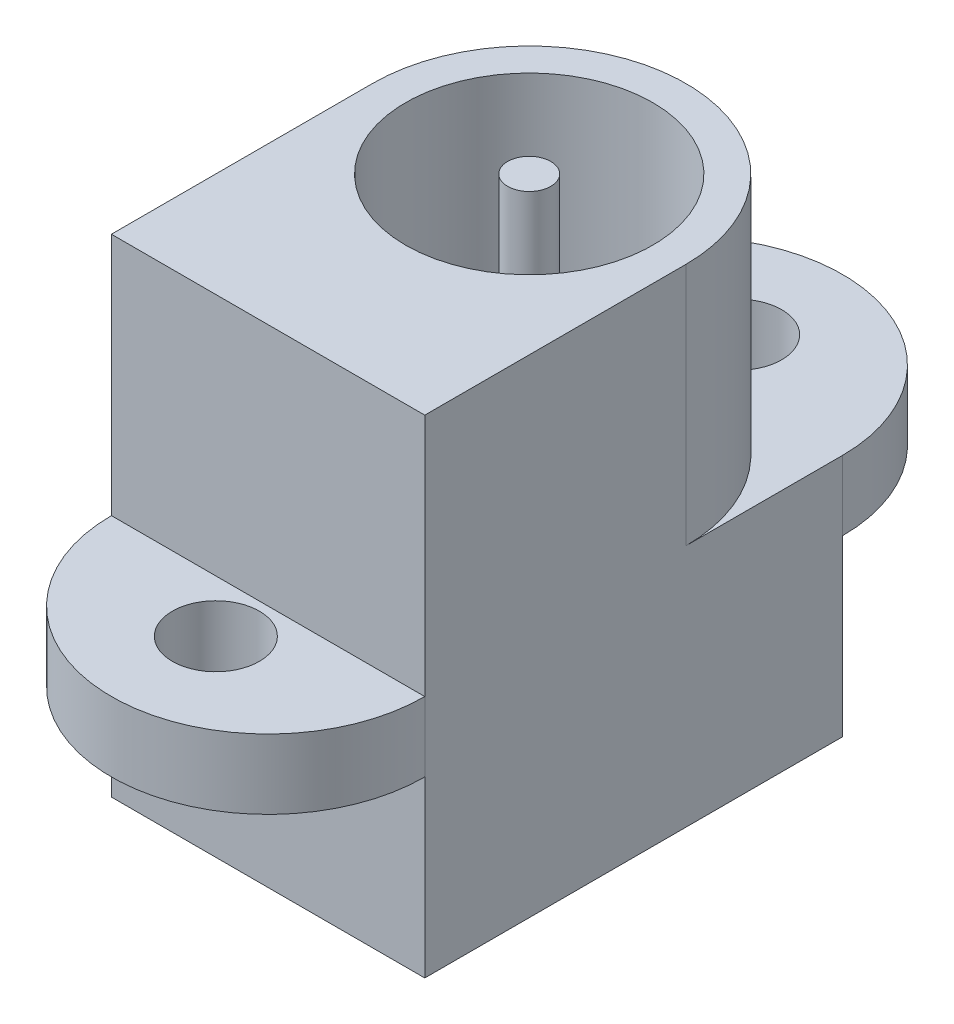
ISO-10303-21;
HEADER;
FILE_DESCRIPTION(('STEP AP214'),'2;1');
FILE_NAME('part.step','',(''),(''),'','','');
FILE_SCHEMA(('AUTOMOTIVE_DESIGN { 1 0 10303 214 1 1 1 1 }'));
ENDSEC;
DATA;
#1=APPLICATION_CONTEXT('core data for automotive mechanical design processes');
#2=APPLICATION_PROTOCOL_DEFINITION('international standard','automotive_design',2000,#1);
#3=PRODUCT_CONTEXT('',#1,'mechanical');
#4=PRODUCT('Part','Part','',(#3));
#5=PRODUCT_RELATED_PRODUCT_CATEGORY('part','',(#4));
#6=PRODUCT_DEFINITION_FORMATION('','',#4);
#7=PRODUCT_DEFINITION_CONTEXT('part definition',#1,'design');
#8=PRODUCT_DEFINITION('design','',#6,#7);
#9=PRODUCT_DEFINITION_SHAPE('','',#8);
#10=(LENGTH_UNIT() NAMED_UNIT(*) SI_UNIT(.MILLI.,.METRE.));
#11=(NAMED_UNIT(*) PLANE_ANGLE_UNIT() SI_UNIT($,.RADIAN.));
#12=(NAMED_UNIT(*) SI_UNIT($,.STERADIAN.) SOLID_ANGLE_UNIT());
#13=UNCERTAINTY_MEASURE_WITH_UNIT(LENGTH_MEASURE(1.E-05),#10,'distance_accuracy_value','');
#14=(GEOMETRIC_REPRESENTATION_CONTEXT(3) GLOBAL_UNCERTAINTY_ASSIGNED_CONTEXT((#13)) GLOBAL_UNIT_ASSIGNED_CONTEXT((#10,
#11,#12)) REPRESENTATION_CONTEXT('',''));
#15=CARTESIAN_POINT('',(0.,0.,0.));
#16=DIRECTION('',(0.,0.,1.));
#17=DIRECTION('',(1.,0.,0.));
#18=AXIS2_PLACEMENT_3D('',#15,#16,#17);
#19=CARTESIAN_POINT('',(0.,-2.,-6.));
#20=DIRECTION('',(0.,1.,0.));
#21=DIRECTION('',(0.,0.,1.));
#22=AXIS2_PLACEMENT_3D('',#19,#20,#21);
#23=PLANE('',#22);
#24=CARTESIAN_POINT('',(0.,-2.,-7.5));
#25=DIRECTION('',(0.,1.,0.));
#26=DIRECTION('',(0.,0.,1.));
#27=AXIS2_PLACEMENT_3D('',#24,#25,#26);
#28=CIRCLE('',#27,1.25);
#29=CARTESIAN_POINT('',(0.,-2.,-6.25));
#30=VERTEX_POINT('',#29);
#31=EDGE_CURVE('E208',#30,#30,#28,.T.);
#32=ORIENTED_EDGE('',*,*,#31,.T.);
#33=EDGE_LOOP('',(#32));
#34=FACE_BOUND('',#33,.T.);
#35=DIRECTION('',(1.,0.,0.));
#36=VECTOR('',#35,1.);
#37=CARTESIAN_POINT('',(4.5,-2.,-6.));
#38=LINE('',#37,#36);
#39=CARTESIAN_POINT('',(-4.5,-2.,-6.));
#40=VERTEX_POINT('',#39);
#41=CARTESIAN_POINT('',(4.5,-2.,-6.));
#42=VERTEX_POINT('',#41);
#43=EDGE_CURVE('E94',#40,#42,#38,.T.);
#44=ORIENTED_EDGE('',*,*,#43,.F.);
#45=CARTESIAN_POINT('',(0.,-2.,-6.));
#46=DIRECTION('',(0.,1.,0.));
#47=DIRECTION('',(0.,0.,1.));
#48=AXIS2_PLACEMENT_3D('',#45,#46,#47);
#49=CIRCLE('',#48,4.5);
#50=EDGE_CURVE('E214',#42,#40,#49,.T.);
#51=ORIENTED_EDGE('',*,*,#50,.F.);
#52=EDGE_LOOP('',(#44,#51));
#53=FACE_BOUND('',#52,.T.);
#54=ADVANCED_FACE('F48',(#34,#53),#23,.F.);
#55=CARTESIAN_POINT('',(0.,-2.,7.5));
#56=DIRECTION('',(0.,1.,0.));
#57=DIRECTION('',(0.,0.,1.));
#58=AXIS2_PLACEMENT_3D('',#55,#56,#57);
#59=CIRCLE('',#58,1.25);
#60=CARTESIAN_POINT('',(0.,-2.,8.75));
#61=VERTEX_POINT('',#60);
#62=EDGE_CURVE('E199',#61,#61,#59,.T.);
#63=ORIENTED_EDGE('',*,*,#62,.T.);
#64=EDGE_LOOP('',(#63));
#65=FACE_BOUND('',#64,.T.);
#66=DIRECTION('',(-1.,0.,0.));
#67=VECTOR('',#66,1.);
#68=CARTESIAN_POINT('',(4.5,-2.,6.));
#69=LINE('',#68,#67);
#70=CARTESIAN_POINT('',(4.5,-2.,6.));
#71=VERTEX_POINT('',#70);
#72=CARTESIAN_POINT('',(-4.5,-2.,6.));
#73=VERTEX_POINT('',#72);
#74=EDGE_CURVE('E253',#71,#73,#69,.T.);
#75=ORIENTED_EDGE('',*,*,#74,.F.);
#76=CARTESIAN_POINT('',(0.,-2.,6.));
#77=DIRECTION('',(0.,1.,0.));
#78=DIRECTION('',(0.,0.,1.));
#79=AXIS2_PLACEMENT_3D('',#76,#77,#78);
#80=CIRCLE('',#79,4.5);
#81=EDGE_CURVE('E216',#73,#71,#80,.T.);
#82=ORIENTED_EDGE('',*,*,#81,.F.);
#83=EDGE_LOOP('',(#75,#82));
#84=FACE_BOUND('',#83,.T.);
#85=ADVANCED_FACE('F266',(#65,#84),#23,.F.);
#86=CARTESIAN_POINT('',(0.,0.,-6.));
#87=DIRECTION('',(0.,1.,0.));
#88=DIRECTION('',(0.,0.,1.));
#89=AXIS2_PLACEMENT_3D('',#86,#87,#88);
#90=PLANE('',#89);
#91=CARTESIAN_POINT('',(0.,0.,-1.5));
#92=DIRECTION('',(0.,1.,0.));
#93=DIRECTION('',(0.,0.,1.));
#94=AXIS2_PLACEMENT_3D('',#91,#92,#93);
#95=CIRCLE('',#94,3.54889262733616);
#96=CARTESIAN_POINT('',(0.,0.,2.04889262733616));
#97=VERTEX_POINT('',#96);
#98=EDGE_CURVE('E162',#97,#97,#95,.T.);
#99=ORIENTED_EDGE('',*,*,#98,.T.);
#100=EDGE_LOOP('',(#99));
#101=FACE_BOUND('',#100,.T.);
#102=CARTESIAN_POINT('',(0.,0.,-1.5));
#103=DIRECTION('',(0.,1.,0.));
#104=DIRECTION('',(0.,0.,1.));
#105=AXIS2_PLACEMENT_3D('',#102,#103,#104);
#106=CIRCLE('',#105,0.619205298013242);
#107=CARTESIAN_POINT('',(0.,0.,-0.880794701986761));
#108=VERTEX_POINT('',#107);
#109=EDGE_CURVE('E152',#108,#108,#106,.T.);
#110=ORIENTED_EDGE('',*,*,#109,.F.);
#111=EDGE_LOOP('',(#110));
#112=FACE_BOUND('',#111,.T.);
#113=ADVANCED_FACE('F272',(#101,#112),#90,.T.);
#114=DIRECTION('',(1.,0.,0.));
#115=VECTOR('',#114,1.);
#116=CARTESIAN_POINT('',(-17.9124652197812,0.,6.));
#117=LINE('',#116,#115);
#118=CARTESIAN_POINT('',(-4.5,0.,6.));
#119=VERTEX_POINT('',#118);
#120=CARTESIAN_POINT('',(4.5,0.,6.));
#121=VERTEX_POINT('',#120);
#122=EDGE_CURVE('E168',#119,#121,#117,.T.);
#123=ORIENTED_EDGE('',*,*,#122,.F.);
#124=CARTESIAN_POINT('',(0.,0.,6.));
#125=DIRECTION('',(0.,1.,0.));
#126=DIRECTION('',(0.,0.,1.));
#127=AXIS2_PLACEMENT_3D('',#124,#125,#126);
#128=CIRCLE('',#127,4.5);
#129=EDGE_CURVE('E223',#119,#121,#128,.T.);
#130=ORIENTED_EDGE('',*,*,#129,.T.);
#131=EDGE_LOOP('',(#123,#130));
#132=FACE_BOUND('',#131,.T.);
#133=CARTESIAN_POINT('',(0.,0.,7.5));
#134=DIRECTION('',(0.,1.,0.));
#135=DIRECTION('',(0.,0.,1.));
#136=AXIS2_PLACEMENT_3D('',#133,#134,#135);
#137=CIRCLE('',#136,1.25);
#138=CARTESIAN_POINT('',(0.,0.,8.75));
#139=VERTEX_POINT('',#138);
#140=EDGE_CURVE('E195',#139,#139,#137,.T.);
#141=ORIENTED_EDGE('',*,*,#140,.F.);
#142=EDGE_LOOP('',(#141));
#143=FACE_BOUND('',#142,.T.);
#144=ADVANCED_FACE('F238',(#132,#143),#90,.T.);
#145=CARTESIAN_POINT('',(0.,-2.,-6.));
#146=DIRECTION('',(0.,1.,0.));
#147=DIRECTION('',(0.,0.,1.));
#148=AXIS2_PLACEMENT_3D('',#145,#146,#147);
#149=CYLINDRICAL_SURFACE('',#148,4.5);
#150=CARTESIAN_POINT('',(0.,0.,-6.));
#151=DIRECTION('',(0.,1.,0.));
#152=DIRECTION('',(0.,0.,1.));
#153=AXIS2_PLACEMENT_3D('',#150,#151,#152);
#154=CIRCLE('',#153,4.5);
#155=CARTESIAN_POINT('',(4.5,0.,-6.));
#156=VERTEX_POINT('',#155);
#157=CARTESIAN_POINT('',(-4.5,0.,-6.));
#158=VERTEX_POINT('',#157);
#159=EDGE_CURVE('E211',#156,#158,#154,.T.);
#160=ORIENTED_EDGE('',*,*,#159,.F.);
#161=DIRECTION('',(0.,1.,0.));
#162=VECTOR('',#161,1.);
#163=CARTESIAN_POINT('',(4.5,-2.,-6.));
#164=LINE('',#163,#162);
#165=EDGE_CURVE('E12',#42,#156,#164,.T.);
#166=ORIENTED_EDGE('',*,*,#165,.F.);
#167=ORIENTED_EDGE('',*,*,#50,.T.);
#168=DIRECTION('',(0.,1.,0.));
#169=VECTOR('',#168,1.);
#170=CARTESIAN_POINT('',(-4.5,-2.,-6.));
#171=LINE('',#170,#169);
#172=EDGE_CURVE('E218',#40,#158,#171,.T.);
#173=ORIENTED_EDGE('',*,*,#172,.T.);
#174=EDGE_LOOP('',(#160,#166,#167,#173));
#175=FACE_BOUND('',#174,.T.);
#176=ADVANCED_FACE('F50',(#175),#149,.T.);
#177=CARTESIAN_POINT('',(4.5,-2.,6.));
#178=DIRECTION('',(1.,0.,0.));
#179=DIRECTION('',(0.,0.,-1.));
#180=AXIS2_PLACEMENT_3D('',#177,#178,#179);
#181=PLANE('',#180);
#182=DIRECTION('',(0.,0.,-1.));
#183=VECTOR('',#182,1.);
#184=CARTESIAN_POINT('',(4.5,0.,6.));
#185=LINE('',#184,#183);
#186=CARTESIAN_POINT('',(4.5,0.,-1.5));
#187=VERTEX_POINT('',#186);
#188=EDGE_CURVE('E90',#187,#156,#185,.T.);
#189=ORIENTED_EDGE('',*,*,#188,.F.);
#190=DIRECTION('',(0.,-1.,0.));
#191=VECTOR('',#190,1.);
#192=CARTESIAN_POINT('',(4.5,7.,-1.5));
#193=LINE('',#192,#191);
#194=CARTESIAN_POINT('',(4.5,7.,-1.5));
#195=VERTEX_POINT('',#194);
#196=EDGE_CURVE('E191',#195,#187,#193,.T.);
#197=ORIENTED_EDGE('',*,*,#196,.F.);
#198=DIRECTION('',(0.,0.,-1.));
#199=VECTOR('',#198,1.);
#200=CARTESIAN_POINT('',(4.5,7.,0.));
#201=LINE('',#200,#199);
#202=CARTESIAN_POINT('',(4.5,7.,6.));
#203=VERTEX_POINT('',#202);
#204=EDGE_CURVE('E167',#203,#195,#201,.T.);
#205=ORIENTED_EDGE('',*,*,#204,.F.);
#206=DIRECTION('',(0.,-1.,0.));
#207=VECTOR('',#206,1.);
#208=CARTESIAN_POINT('',(4.5,7.,6.));
#209=LINE('',#208,#207);
#210=EDGE_CURVE('E177',#203,#121,#209,.T.);
#211=ORIENTED_EDGE('',*,*,#210,.T.);
#212=DIRECTION('',(0.,1.,0.));
#213=VECTOR('',#212,1.);
#214=CARTESIAN_POINT('',(4.5,-2.,6.));
#215=LINE('',#214,#213);
#216=EDGE_CURVE('E57',#71,#121,#215,.T.);
#217=ORIENTED_EDGE('',*,*,#216,.F.);
#218=DIRECTION('',(0.,1.,0.));
#219=VECTOR('',#218,1.);
#220=CARTESIAN_POINT('',(4.5,-7.,6.));
#221=LINE('',#220,#219);
#222=CARTESIAN_POINT('',(4.5,-7.,6.));
#223=VERTEX_POINT('',#222);
#224=EDGE_CURVE('E132',#223,#71,#221,.T.);
#225=ORIENTED_EDGE('',*,*,#224,.F.);
#226=DIRECTION('',(0.,0.,1.));
#227=VECTOR('',#226,1.);
#228=CARTESIAN_POINT('',(4.5,-7.,6.));
#229=LINE('',#228,#227);
#230=CARTESIAN_POINT('',(4.5,-7.,-6.));
#231=VERTEX_POINT('',#230);
#232=EDGE_CURVE('E138',#231,#223,#229,.T.);
#233=ORIENTED_EDGE('',*,*,#232,.F.);
#234=DIRECTION('',(0.,1.,0.));
#235=VECTOR('',#234,1.);
#236=CARTESIAN_POINT('',(4.5,-7.,-6.));
#237=LINE('',#236,#235);
#238=EDGE_CURVE('E260',#231,#42,#237,.T.);
#239=ORIENTED_EDGE('',*,*,#238,.T.);
#240=ORIENTED_EDGE('',*,*,#165,.T.);
#241=EDGE_LOOP('',(#189,#197,#205,#211,#217,#225,#233,#239,#240));
#242=FACE_BOUND('',#241,.T.);
#243=ADVANCED_FACE('F149',(#242),#181,.T.);
#244=CARTESIAN_POINT('',(0.,-2.,6.));
#245=DIRECTION('',(0.,1.,0.));
#246=DIRECTION('',(0.,0.,1.));
#247=AXIS2_PLACEMENT_3D('',#244,#245,#246);
#248=CYLINDRICAL_SURFACE('',#247,4.5);
#249=ORIENTED_EDGE('',*,*,#129,.F.);
#250=DIRECTION('',(0.,1.,0.));
#251=VECTOR('',#250,1.);
#252=CARTESIAN_POINT('',(-4.5,-2.,6.));
#253=LINE('',#252,#251);
#254=EDGE_CURVE('E226',#73,#119,#253,.T.);
#255=ORIENTED_EDGE('',*,*,#254,.F.);
#256=ORIENTED_EDGE('',*,*,#81,.T.);
#257=ORIENTED_EDGE('',*,*,#216,.T.);
#258=EDGE_LOOP('',(#249,#255,#256,#257));
#259=FACE_BOUND('',#258,.T.);
#260=ADVANCED_FACE('F233',(#259),#248,.T.);
#261=CARTESIAN_POINT('',(-4.5,-2.,-6.));
#262=DIRECTION('',(-1.,0.,0.));
#263=DIRECTION('',(0.,0.,1.));
#264=AXIS2_PLACEMENT_3D('',#261,#262,#263);
#265=PLANE('',#264);
#266=DIRECTION('',(0.,0.,1.));
#267=VECTOR('',#266,1.);
#268=CARTESIAN_POINT('',(-4.5,0.,-6.));
#269=LINE('',#268,#267);
#270=CARTESIAN_POINT('',(-4.5,0.,-1.5));
#271=VERTEX_POINT('',#270);
#272=EDGE_CURVE('E220',#158,#271,#269,.T.);
#273=ORIENTED_EDGE('',*,*,#272,.F.);
#274=ORIENTED_EDGE('',*,*,#172,.F.);
#275=DIRECTION('',(0.,1.,0.));
#276=VECTOR('',#275,1.);
#277=CARTESIAN_POINT('',(-4.5,-7.,-6.));
#278=LINE('',#277,#276);
#279=CARTESIAN_POINT('',(-4.5,-7.,-6.));
#280=VERTEX_POINT('',#279);
#281=EDGE_CURVE('E157',#280,#40,#278,.T.);
#282=ORIENTED_EDGE('',*,*,#281,.F.);
#283=DIRECTION('',(0.,0.,-1.));
#284=VECTOR('',#283,1.);
#285=CARTESIAN_POINT('',(-4.5,-7.,6.));
#286=LINE('',#285,#284);
#287=CARTESIAN_POINT('',(-4.5,-7.,6.));
#288=VERTEX_POINT('',#287);
#289=EDGE_CURVE('E137',#288,#280,#286,.T.);
#290=ORIENTED_EDGE('',*,*,#289,.F.);
#291=DIRECTION('',(0.,1.,0.));
#292=VECTOR('',#291,1.);
#293=CARTESIAN_POINT('',(-4.5,-7.,6.));
#294=LINE('',#293,#292);
#295=EDGE_CURVE('E134',#288,#73,#294,.T.);
#296=ORIENTED_EDGE('',*,*,#295,.T.);
#297=ORIENTED_EDGE('',*,*,#254,.T.);
#298=DIRECTION('',(0.,-1.,0.));
#299=VECTOR('',#298,1.);
#300=CARTESIAN_POINT('',(-4.5,7.,6.));
#301=LINE('',#300,#299);
#302=CARTESIAN_POINT('',(-4.5,7.,6.));
#303=VERTEX_POINT('',#302);
#304=EDGE_CURVE('E192',#303,#119,#301,.T.);
#305=ORIENTED_EDGE('',*,*,#304,.F.);
#306=DIRECTION('',(0.,0.,1.));
#307=VECTOR('',#306,1.);
#308=CARTESIAN_POINT('',(-4.5,7.,0.));
#309=LINE('',#308,#307);
#310=CARTESIAN_POINT('',(-4.5,7.,-1.5));
#311=VERTEX_POINT('',#310);
#312=EDGE_CURVE('E173',#311,#303,#309,.T.);
#313=ORIENTED_EDGE('',*,*,#312,.F.);
#314=DIRECTION('',(0.,-1.,0.));
#315=VECTOR('',#314,1.);
#316=CARTESIAN_POINT('',(-4.5,7.,-1.5));
#317=LINE('',#316,#315);
#318=EDGE_CURVE('E188',#311,#271,#317,.T.);
#319=ORIENTED_EDGE('',*,*,#318,.T.);
#320=EDGE_LOOP('',(#273,#274,#282,#290,#296,#297,#305,#313,#319));
#321=FACE_BOUND('',#320,.T.);
#322=ADVANCED_FACE('F252',(#321),#265,.T.);
#323=CARTESIAN_POINT('',(0.,0.,-1.5));
#324=DIRECTION('',(0.,1.,0.));
#325=DIRECTION('',(0.,0.,1.));
#326=AXIS2_PLACEMENT_3D('',#323,#324,#325);
#327=CIRCLE('',#326,4.5);
#328=EDGE_CURVE('E65',#187,#271,#327,.T.);
#329=ORIENTED_EDGE('',*,*,#328,.F.);
#330=ORIENTED_EDGE('',*,*,#188,.T.);
#331=ORIENTED_EDGE('',*,*,#159,.T.);
#332=ORIENTED_EDGE('',*,*,#272,.T.);
#333=EDGE_LOOP('',(#329,#330,#331,#332));
#334=FACE_BOUND('',#333,.T.);
#335=CARTESIAN_POINT('',(0.,0.,-7.5));
#336=DIRECTION('',(0.,1.,0.));
#337=DIRECTION('',(0.,0.,1.));
#338=AXIS2_PLACEMENT_3D('',#335,#336,#337);
#339=CIRCLE('',#338,1.25);
#340=CARTESIAN_POINT('',(0.,0.,-6.25));
#341=VERTEX_POINT('',#340);
#342=EDGE_CURVE('E204',#341,#341,#339,.T.);
#343=ORIENTED_EDGE('',*,*,#342,.F.);
#344=EDGE_LOOP('',(#343));
#345=FACE_BOUND('',#344,.T.);
#346=ADVANCED_FACE('F278',(#334,#345),#90,.T.);
#347=CARTESIAN_POINT('',(0.,-2.,-7.5));
#348=DIRECTION('',(0.,1.,0.));
#349=DIRECTION('',(0.,0.,1.));
#350=AXIS2_PLACEMENT_3D('',#347,#348,#349);
#351=CYLINDRICAL_SURFACE('',#350,1.25);
#352=ORIENTED_EDGE('',*,*,#31,.F.);
#353=EDGE_LOOP('',(#352));
#354=FACE_BOUND('',#353,.T.);
#355=ORIENTED_EDGE('',*,*,#342,.T.);
#356=EDGE_LOOP('',(#355));
#357=FACE_BOUND('',#356,.T.);
#358=ADVANCED_FACE('F276',(#354,#357),#351,.F.);
#359=CARTESIAN_POINT('',(0.,-2.,7.5));
#360=DIRECTION('',(0.,1.,0.));
#361=DIRECTION('',(0.,0.,1.));
#362=AXIS2_PLACEMENT_3D('',#359,#360,#361);
#363=CYLINDRICAL_SURFACE('',#362,1.25);
#364=ORIENTED_EDGE('',*,*,#62,.F.);
#365=EDGE_LOOP('',(#364));
#366=FACE_BOUND('',#365,.T.);
#367=ORIENTED_EDGE('',*,*,#140,.T.);
#368=EDGE_LOOP('',(#367));
#369=FACE_BOUND('',#368,.T.);
#370=ADVANCED_FACE('F302',(#366,#369),#363,.F.);
#371=CARTESIAN_POINT('',(0.,7.,-1.5));
#372=DIRECTION('',(0.,-1.,0.));
#373=DIRECTION('',(0.,0.,-1.));
#374=AXIS2_PLACEMENT_3D('',#371,#372,#373);
#375=CYLINDRICAL_SURFACE('',#374,4.5);
#376=ORIENTED_EDGE('',*,*,#328,.T.);
#377=ORIENTED_EDGE('',*,*,#318,.F.);
#378=CARTESIAN_POINT('',(0.,7.,-1.5));
#379=DIRECTION('',(0.,1.,0.));
#380=DIRECTION('',(0.,0.,1.));
#381=AXIS2_PLACEMENT_3D('',#378,#379,#380);
#382=CIRCLE('',#381,4.5);
#383=EDGE_CURVE('E171',#195,#311,#382,.T.);
#384=ORIENTED_EDGE('',*,*,#383,.F.);
#385=ORIENTED_EDGE('',*,*,#196,.T.);
#386=EDGE_LOOP('',(#376,#377,#384,#385));
#387=FACE_BOUND('',#386,.T.);
#388=ADVANCED_FACE('F309',(#387),#375,.T.);
#389=CARTESIAN_POINT('',(0.,7.,-1.5));
#390=DIRECTION('',(0.,-1.,0.));
#391=DIRECTION('',(0.,0.,-1.));
#392=AXIS2_PLACEMENT_3D('',#389,#390,#391);
#393=CYLINDRICAL_SURFACE('',#392,3.54889262733616);
#394=CARTESIAN_POINT('',(0.,7.,-1.5));
#395=DIRECTION('',(0.,1.,0.));
#396=DIRECTION('',(0.,0.,1.));
#397=AXIS2_PLACEMENT_3D('',#394,#395,#396);
#398=CIRCLE('',#397,3.54889262733616);
#399=CARTESIAN_POINT('',(0.,7.,2.04889262733616));
#400=VERTEX_POINT('',#399);
#401=EDGE_CURVE('E164',#400,#400,#398,.T.);
#402=ORIENTED_EDGE('',*,*,#401,.T.);
#403=EDGE_LOOP('',(#402));
#404=FACE_BOUND('',#403,.T.);
#405=ORIENTED_EDGE('',*,*,#98,.F.);
#406=EDGE_LOOP('',(#405));
#407=FACE_BOUND('',#406,.T.);
#408=ADVANCED_FACE('F316',(#404,#407),#393,.F.);
#409=CARTESIAN_POINT('',(-17.9124652197812,7.,6.));
#410=DIRECTION('',(0.,0.,-1.));
#411=DIRECTION('',(-1.,0.,0.));
#412=AXIS2_PLACEMENT_3D('',#409,#410,#411);
#413=PLANE('',#412);
#414=ORIENTED_EDGE('',*,*,#122,.T.);
#415=ORIENTED_EDGE('',*,*,#210,.F.);
#416=DIRECTION('',(1.,0.,0.));
#417=VECTOR('',#416,1.);
#418=CARTESIAN_POINT('',(-17.9124652197812,7.,6.));
#419=LINE('',#418,#417);
#420=EDGE_CURVE('E175',#303,#203,#419,.T.);
#421=ORIENTED_EDGE('',*,*,#420,.F.);
#422=ORIENTED_EDGE('',*,*,#304,.T.);
#423=EDGE_LOOP('',(#414,#415,#421,#422));
#424=FACE_BOUND('',#423,.T.);
#425=ADVANCED_FACE('F242',(#424),#413,.F.);
#426=CARTESIAN_POINT('',(-17.9124652197812,7.,0.));
#427=DIRECTION('',(0.,1.,0.));
#428=DIRECTION('',(0.,0.,1.));
#429=AXIS2_PLACEMENT_3D('',#426,#427,#428);
#430=PLANE('',#429);
#431=ORIENTED_EDGE('',*,*,#401,.F.);
#432=EDGE_LOOP('',(#431));
#433=FACE_BOUND('',#432,.T.);
#434=ORIENTED_EDGE('',*,*,#204,.T.);
#435=ORIENTED_EDGE('',*,*,#383,.T.);
#436=ORIENTED_EDGE('',*,*,#312,.T.);
#437=ORIENTED_EDGE('',*,*,#420,.T.);
#438=EDGE_LOOP('',(#434,#435,#436,#437));
#439=FACE_BOUND('',#438,.T.);
#440=ADVANCED_FACE('F247',(#433,#439),#430,.T.);
#441=CARTESIAN_POINT('',(0.,7.,-1.5));
#442=DIRECTION('',(0.,-1.,0.));
#443=DIRECTION('',(0.,0.,-1.));
#444=AXIS2_PLACEMENT_3D('',#441,#442,#443);
#445=CYLINDRICAL_SURFACE('',#444,0.619205298013242);
#446=CARTESIAN_POINT('',(0.,7.,-1.5));
#447=DIRECTION('',(0.,1.,0.));
#448=DIRECTION('',(0.,0.,1.));
#449=AXIS2_PLACEMENT_3D('',#446,#447,#448);
#450=CIRCLE('',#449,0.619205298013242);
#451=CARTESIAN_POINT('',(0.,7.,-0.880794701986761));
#452=VERTEX_POINT('',#451);
#453=EDGE_CURVE('E155',#452,#452,#450,.T.);
#454=ORIENTED_EDGE('',*,*,#453,.F.);
#455=EDGE_LOOP('',(#454));
#456=FACE_BOUND('',#455,.T.);
#457=ORIENTED_EDGE('',*,*,#109,.T.);
#458=EDGE_LOOP('',(#457));
#459=FACE_BOUND('',#458,.T.);
#460=ADVANCED_FACE('F336',(#456,#459),#445,.T.);
#461=CARTESIAN_POINT('',(-17.9124652197812,7.,0.));
#462=DIRECTION('',(0.,1.,0.));
#463=DIRECTION('',(0.,0.,1.));
#464=AXIS2_PLACEMENT_3D('',#461,#462,#463);
#465=PLANE('',#464);
#466=ORIENTED_EDGE('',*,*,#453,.T.);
#467=EDGE_LOOP('',(#466));
#468=FACE_BOUND('',#467,.T.);
#469=ADVANCED_FACE('F344',(#468),#465,.T.);
#470=CARTESIAN_POINT('',(4.5,-7.,6.));
#471=DIRECTION('',(0.,0.,-1.));
#472=DIRECTION('',(-1.,0.,0.));
#473=AXIS2_PLACEMENT_3D('',#470,#471,#472);
#474=PLANE('',#473);
#475=ORIENTED_EDGE('',*,*,#74,.T.);
#476=ORIENTED_EDGE('',*,*,#295,.F.);
#477=DIRECTION('',(-1.,0.,0.));
#478=VECTOR('',#477,1.);
#479=CARTESIAN_POINT('',(4.5,-7.,6.));
#480=LINE('',#479,#478);
#481=EDGE_CURVE('E127',#223,#288,#480,.T.);
#482=ORIENTED_EDGE('',*,*,#481,.F.);
#483=ORIENTED_EDGE('',*,*,#224,.T.);
#484=EDGE_LOOP('',(#475,#476,#482,#483));
#485=FACE_BOUND('',#484,.T.);
#486=ADVANCED_FACE('F130',(#485),#474,.F.);
#487=CARTESIAN_POINT('',(4.5,-7.,-6.));
#488=DIRECTION('',(0.,0.,1.));
#489=DIRECTION('',(1.,0.,0.));
#490=AXIS2_PLACEMENT_3D('',#487,#488,#489);
#491=PLANE('',#490);
#492=ORIENTED_EDGE('',*,*,#43,.T.);
#493=ORIENTED_EDGE('',*,*,#238,.F.);
#494=DIRECTION('',(1.,0.,0.));
#495=VECTOR('',#494,1.);
#496=CARTESIAN_POINT('',(4.5,-7.,-6.));
#497=LINE('',#496,#495);
#498=EDGE_CURVE('E143',#280,#231,#497,.T.);
#499=ORIENTED_EDGE('',*,*,#498,.F.);
#500=ORIENTED_EDGE('',*,*,#281,.T.);
#501=EDGE_LOOP('',(#492,#493,#499,#500));
#502=FACE_BOUND('',#501,.T.);
#503=ADVANCED_FACE('F264',(#502),#491,.F.);
#504=CARTESIAN_POINT('',(4.5,-7.,-6.));
#505=DIRECTION('',(0.,1.,0.));
#506=DIRECTION('',(0.,0.,1.));
#507=AXIS2_PLACEMENT_3D('',#504,#505,#506);
#508=PLANE('',#507);
#509=ORIENTED_EDGE('',*,*,#232,.T.);
#510=ORIENTED_EDGE('',*,*,#481,.T.);
#511=ORIENTED_EDGE('',*,*,#289,.T.);
#512=ORIENTED_EDGE('',*,*,#498,.T.);
#513=EDGE_LOOP('',(#509,#510,#511,#512));
#514=FACE_BOUND('',#513,.T.);
#515=ADVANCED_FACE('F141',(#514),#508,.F.);
#516=CLOSED_SHELL('',(#54,#85,#113,#144,#176,#243,#260,#322,#346,#358,#370,#388,#408,#425,#440,
#460,#469,#486,#503,#515));
#517=MANIFOLD_SOLID_BREP('B2',#516);
#518=ADVANCED_BREP_SHAPE_REPRESENTATION('',(#18,#517),#14);
#519=SHAPE_DEFINITION_REPRESENTATION(#9,#518);
ENDSEC;
END-ISO-10303-21;
